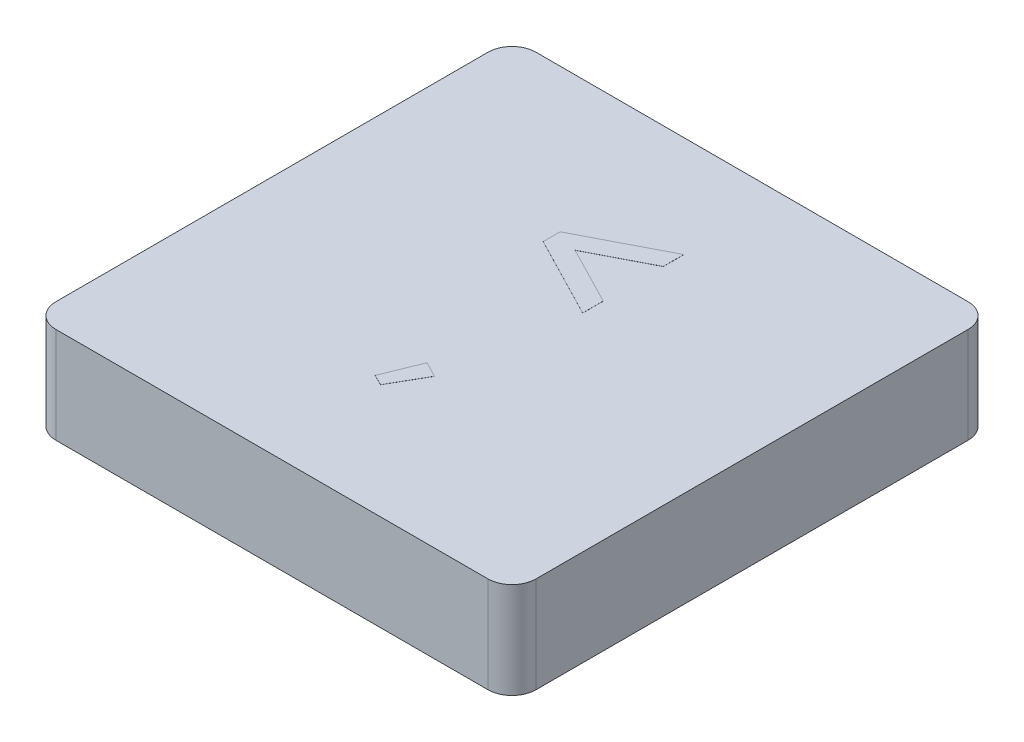
ISO-10303-21;
HEADER;
FILE_DESCRIPTION(('STEP AP214'),'2;1');
FILE_NAME('part.step','',(''),(''),'','','');
FILE_SCHEMA(('AUTOMOTIVE_DESIGN { 1 0 10303 214 1 1 1 1 }'));
ENDSEC;
DATA;
#1=APPLICATION_CONTEXT('core data for automotive mechanical design processes');
#2=APPLICATION_PROTOCOL_DEFINITION('international standard','automotive_design',2000,#1);
#3=PRODUCT_CONTEXT('',#1,'mechanical');
#4=PRODUCT('Part','Part','',(#3));
#5=PRODUCT_RELATED_PRODUCT_CATEGORY('part','',(#4));
#6=PRODUCT_DEFINITION_FORMATION('','',#4);
#7=PRODUCT_DEFINITION_CONTEXT('part definition',#1,'design');
#8=PRODUCT_DEFINITION('design','',#6,#7);
#9=PRODUCT_DEFINITION_SHAPE('','',#8);
#10=(LENGTH_UNIT() NAMED_UNIT(*) SI_UNIT(.MILLI.,.METRE.));
#11=(NAMED_UNIT(*) PLANE_ANGLE_UNIT() SI_UNIT($,.RADIAN.));
#12=(NAMED_UNIT(*) SI_UNIT($,.STERADIAN.) SOLID_ANGLE_UNIT());
#13=UNCERTAINTY_MEASURE_WITH_UNIT(LENGTH_MEASURE(1.E-05),#10,'distance_accuracy_value','');
#14=(GEOMETRIC_REPRESENTATION_CONTEXT(3) GLOBAL_UNCERTAINTY_ASSIGNED_CONTEXT((#13)) GLOBAL_UNIT_ASSIGNED_CONTEXT((#10,
#11,#12)) REPRESENTATION_CONTEXT('',''));
#15=CARTESIAN_POINT('',(0.,0.,0.));
#16=DIRECTION('',(0.,0.,1.));
#17=DIRECTION('',(1.,0.,0.));
#18=AXIS2_PLACEMENT_3D('',#15,#16,#17);
#19=CARTESIAN_POINT('',(0.,2.54,-12.7));
#20=DIRECTION('',(1.,0.,0.));
#21=DIRECTION('',(0.,0.,-1.));
#22=AXIS2_PLACEMENT_3D('',#19,#20,#21);
#23=PLANE('',#22);
#24=DIRECTION('',(0.,0.,1.));
#25=VECTOR('',#24,1.);
#26=CARTESIAN_POINT('',(0.,2.54,-12.7));
#27=LINE('',#26,#25);
#28=CARTESIAN_POINT('',(0.,2.54,-12.065));
#29=VERTEX_POINT('',#28);
#30=CARTESIAN_POINT('',(0.,2.54,-0.635));
#31=VERTEX_POINT('',#30);
#32=EDGE_CURVE('E321',#29,#31,#27,.T.);
#33=ORIENTED_EDGE('',*,*,#32,.F.);
#34=DIRECTION('',(0.,-1.,0.));
#35=VECTOR('',#34,1.);
#36=CARTESIAN_POINT('',(0.,2.54,-12.065));
#37=LINE('',#36,#35);
#38=CARTESIAN_POINT('',(0.,0.,-12.065));
#39=VERTEX_POINT('',#38);
#40=EDGE_CURVE('E346',#29,#39,#37,.T.);
#41=ORIENTED_EDGE('',*,*,#40,.T.);
#42=DIRECTION('',(0.,0.,1.));
#43=VECTOR('',#42,1.);
#44=CARTESIAN_POINT('',(0.,0.,-12.7));
#45=LINE('',#44,#43);
#46=CARTESIAN_POINT('',(0.,0.,-0.635));
#47=VERTEX_POINT('',#46);
#48=EDGE_CURVE('E301',#39,#47,#45,.T.);
#49=ORIENTED_EDGE('',*,*,#48,.T.);
#50=DIRECTION('',(0.,-1.,0.));
#51=VECTOR('',#50,1.);
#52=CARTESIAN_POINT('',(0.,2.54,-0.635));
#53=LINE('',#52,#51);
#54=EDGE_CURVE('E334',#47,#31,#53,.F.);
#55=ORIENTED_EDGE('',*,*,#54,.T.);
#56=EDGE_LOOP('',(#33,#41,#49,#55));
#57=FACE_BOUND('',#56,.T.);
#58=ADVANCED_FACE('F33',(#57),#23,.F.);
#59=CARTESIAN_POINT('',(0.,2.54,0.));
#60=DIRECTION('',(0.,0.,-1.));
#61=DIRECTION('',(-1.,0.,0.));
#62=AXIS2_PLACEMENT_3D('',#59,#60,#61);
#63=PLANE('',#62);
#64=DIRECTION('',(1.,0.,0.));
#65=VECTOR('',#64,1.);
#66=CARTESIAN_POINT('',(0.,0.,0.));
#67=LINE('',#66,#65);
#68=CARTESIAN_POINT('',(0.635,0.,0.));
#69=VERTEX_POINT('',#68);
#70=CARTESIAN_POINT('',(12.065,0.,0.));
#71=VERTEX_POINT('',#70);
#72=EDGE_CURVE('E337',#69,#71,#67,.T.);
#73=ORIENTED_EDGE('',*,*,#72,.T.);
#74=DIRECTION('',(0.,-1.,0.));
#75=VECTOR('',#74,1.);
#76=CARTESIAN_POINT('',(12.065,2.54,0.));
#77=LINE('',#76,#75);
#78=CARTESIAN_POINT('',(12.065,2.54,0.));
#79=VERTEX_POINT('',#78);
#80=EDGE_CURVE('E41',#71,#79,#77,.F.);
#81=ORIENTED_EDGE('',*,*,#80,.T.);
#82=DIRECTION('',(1.,0.,0.));
#83=VECTOR('',#82,1.);
#84=CARTESIAN_POINT('',(0.,2.54,0.));
#85=LINE('',#84,#83);
#86=CARTESIAN_POINT('',(0.635,2.54,0.));
#87=VERTEX_POINT('',#86);
#88=EDGE_CURVE('E324',#87,#79,#85,.T.);
#89=ORIENTED_EDGE('',*,*,#88,.F.);
#90=DIRECTION('',(0.,-1.,0.));
#91=VECTOR('',#90,1.);
#92=CARTESIAN_POINT('',(0.635,2.54,0.));
#93=LINE('',#92,#91);
#94=EDGE_CURVE('E375',#87,#69,#93,.T.);
#95=ORIENTED_EDGE('',*,*,#94,.T.);
#96=EDGE_LOOP('',(#73,#81,#89,#95));
#97=FACE_BOUND('',#96,.T.);
#98=ADVANCED_FACE('F380',(#97),#63,.F.);
#99=CARTESIAN_POINT('',(12.7,2.54,0.));
#100=DIRECTION('',(-1.,0.,0.));
#101=DIRECTION('',(0.,0.,1.));
#102=AXIS2_PLACEMENT_3D('',#99,#100,#101);
#103=PLANE('',#102);
#104=DIRECTION('',(0.,0.,-1.));
#105=VECTOR('',#104,1.);
#106=CARTESIAN_POINT('',(12.7,0.,0.));
#107=LINE('',#106,#105);
#108=CARTESIAN_POINT('',(12.7,0.,-0.635));
#109=VERTEX_POINT('',#108);
#110=CARTESIAN_POINT('',(12.7,0.,-12.065));
#111=VERTEX_POINT('',#110);
#112=EDGE_CURVE('E340',#109,#111,#107,.T.);
#113=ORIENTED_EDGE('',*,*,#112,.T.);
#114=DIRECTION('',(0.,-1.,0.));
#115=VECTOR('',#114,1.);
#116=CARTESIAN_POINT('',(12.7,2.54,-12.065));
#117=LINE('',#116,#115);
#118=CARTESIAN_POINT('',(12.7,2.54,-12.065));
#119=VERTEX_POINT('',#118);
#120=EDGE_CURVE('E373',#111,#119,#117,.F.);
#121=ORIENTED_EDGE('',*,*,#120,.T.);
#122=DIRECTION('',(0.,0.,-1.));
#123=VECTOR('',#122,1.);
#124=CARTESIAN_POINT('',(12.7,2.54,0.));
#125=LINE('',#124,#123);
#126=CARTESIAN_POINT('',(12.7,2.54,-0.635));
#127=VERTEX_POINT('',#126);
#128=EDGE_CURVE('E328',#127,#119,#125,.T.);
#129=ORIENTED_EDGE('',*,*,#128,.F.);
#130=DIRECTION('',(0.,-1.,0.));
#131=VECTOR('',#130,1.);
#132=CARTESIAN_POINT('',(12.7,2.54,-0.635));
#133=LINE('',#132,#131);
#134=EDGE_CURVE('E370',#127,#109,#133,.T.);
#135=ORIENTED_EDGE('',*,*,#134,.T.);
#136=EDGE_LOOP('',(#113,#121,#129,#135));
#137=FACE_BOUND('',#136,.T.);
#138=ADVANCED_FACE('F393',(#137),#103,.F.);
#139=CARTESIAN_POINT('',(12.7,2.54,-12.7));
#140=DIRECTION('',(0.,0.,1.));
#141=DIRECTION('',(1.,0.,0.));
#142=AXIS2_PLACEMENT_3D('',#139,#140,#141);
#143=PLANE('',#142);
#144=DIRECTION('',(-1.,0.,0.));
#145=VECTOR('',#144,1.);
#146=CARTESIAN_POINT('',(12.7,0.,-12.7));
#147=LINE('',#146,#145);
#148=CARTESIAN_POINT('',(12.065,0.,-12.7));
#149=VERTEX_POINT('',#148);
#150=CARTESIAN_POINT('',(0.634999999999995,0.,-12.7));
#151=VERTEX_POINT('',#150);
#152=EDGE_CURVE('E325',#149,#151,#147,.T.);
#153=ORIENTED_EDGE('',*,*,#152,.T.);
#154=DIRECTION('',(0.,-1.,0.));
#155=VECTOR('',#154,1.);
#156=CARTESIAN_POINT('',(0.634999999999995,2.54,-12.7));
#157=LINE('',#156,#155);
#158=CARTESIAN_POINT('',(0.634999999999995,2.54,-12.7));
#159=VERTEX_POINT('',#158);
#160=EDGE_CURVE('E360',#151,#159,#157,.F.);
#161=ORIENTED_EDGE('',*,*,#160,.T.);
#162=DIRECTION('',(-1.,0.,0.));
#163=VECTOR('',#162,1.);
#164=CARTESIAN_POINT('',(12.7,2.54,-12.7));
#165=LINE('',#164,#163);
#166=CARTESIAN_POINT('',(12.065,2.54,-12.7));
#167=VERTEX_POINT('',#166);
#168=EDGE_CURVE('E331',#167,#159,#165,.T.);
#169=ORIENTED_EDGE('',*,*,#168,.F.);
#170=DIRECTION('',(0.,-1.,0.));
#171=VECTOR('',#170,1.);
#172=CARTESIAN_POINT('',(12.065,2.54,-12.7));
#173=LINE('',#172,#171);
#174=EDGE_CURVE('E357',#167,#149,#173,.T.);
#175=ORIENTED_EDGE('',*,*,#174,.T.);
#176=EDGE_LOOP('',(#153,#161,#169,#175));
#177=FACE_BOUND('',#176,.T.);
#178=ADVANCED_FACE('F405',(#177),#143,.F.);
#179=CARTESIAN_POINT('',(0.,2.54,0.));
#180=DIRECTION('',(0.,1.,0.));
#181=DIRECTION('',(0.,0.,1.));
#182=AXIS2_PLACEMENT_3D('',#179,#180,#181);
#183=PLANE('',#182);
#184=DIRECTION('',(0.377411788957032,0.,-0.926045539677317));
#185=VECTOR('',#184,1.);
#186=CARTESIAN_POINT('',(5.91212475961538,2.54,-3.16612119391026));
#187=LINE('',#186,#185);
#188=CARTESIAN_POINT('',(5.91212475961538,2.54,-3.16612119391026));
#189=VERTEX_POINT('',#188);
#190=CARTESIAN_POINT('',(6.31027179487179,2.54,-4.14304427083333));
#191=VERTEX_POINT('',#190);
#192=EDGE_CURVE('E217',#189,#191,#187,.T.);
#193=ORIENTED_EDGE('',*,*,#192,.T.);
#194=DIRECTION('',(0.888237171489224,0.,0.459385162129583));
#195=VECTOR('',#194,1.);
#196=CARTESIAN_POINT('',(6.31027179487179,2.54,-4.14304427083333));
#197=LINE('',#196,#195);
#198=CARTESIAN_POINT('',(6.71732307692307,2.54,-3.93252243589744));
#199=VERTEX_POINT('',#198);
#200=EDGE_CURVE('E193',#191,#199,#197,.T.);
#201=ORIENTED_EDGE('',*,*,#200,.T.);
#202=DIRECTION('',(-0.497188445665933,0.,0.867642581652315));
#203=VECTOR('',#202,1.);
#204=CARTESIAN_POINT('',(6.71732307692307,2.54,-3.93252243589744));
#205=LINE('',#204,#203);
#206=CARTESIAN_POINT('',(6.19833269230769,2.54,-3.02683333333333));
#207=VERTEX_POINT('',#206);
#208=EDGE_CURVE('E53',#199,#207,#205,.T.);
#209=ORIENTED_EDGE('',*,*,#208,.T.);
#210=DIRECTION('',(-0.899171345852742,0.,-0.437596721648333));
#211=VECTOR('',#210,1.);
#212=CARTESIAN_POINT('',(6.19833269230769,2.54,-3.02683333333333));
#213=LINE('',#212,#211);
#214=EDGE_CURVE('E48',#207,#189,#213,.T.);
#215=ORIENTED_EDGE('',*,*,#214,.T.);
#216=EDGE_LOOP('',(#193,#201,#209,#215));
#217=FACE_BOUND('',#216,.T.);
#218=DIRECTION('',(0.888620657054864,0.,0.458642919770252));
#219=VECTOR('',#218,1.);
#220=CARTESIAN_POINT('',(5.68971193910256,2.54,-8.67914743589743));
#221=LINE('',#220,#219);
#222=CARTESIAN_POINT('',(5.68971193910256,2.54,-8.67914743589743));
#223=VERTEX_POINT('',#222);
#224=CARTESIAN_POINT('',(7.22760256410256,2.54,-7.88539743589743));
#225=VERTEX_POINT('',#224);
#226=EDGE_CURVE('E222',#223,#225,#221,.T.);
#227=ORIENTED_EDGE('',*,*,#226,.T.);
#228=DIRECTION('',(0.,0.,1.));
#229=VECTOR('',#228,1.);
#230=CARTESIAN_POINT('',(7.22760256410256,2.54,-7.88539743589743));
#231=LINE('',#230,#229);
#232=CARTESIAN_POINT('',(7.22760256410256,2.54,-7.34160236378205));
#233=VERTEX_POINT('',#232);
#234=EDGE_CURVE('E250',#225,#233,#231,.T.);
#235=ORIENTED_EDGE('',*,*,#234,.T.);
#236=DIRECTION('',(-0.888589658192358,0.,-0.458702975086916));
#237=VECTOR('',#236,1.);
#238=CARTESIAN_POINT('',(7.22760256410256,2.54,-7.34160236378205));
#239=LINE('',#238,#237);
#240=CARTESIAN_POINT('',(5.07023076923076,2.54,-8.45526923076923));
#241=VERTEX_POINT('',#240);
#242=EDGE_CURVE('E252',#233,#241,#239,.T.);
#243=ORIENTED_EDGE('',*,*,#242,.T.);
#244=DIRECTION('',(0.,0.,-1.));
#245=VECTOR('',#244,1.);
#246=CARTESIAN_POINT('',(5.07023076923076,2.54,-8.45526923076923));
#247=LINE('',#246,#245);
#248=CARTESIAN_POINT('',(5.07023076923076,2.54,-8.90366165865385));
#249=VERTEX_POINT('',#248);
#250=EDGE_CURVE('E254',#241,#249,#247,.T.);
#251=ORIENTED_EDGE('',*,*,#250,.T.);
#252=DIRECTION('',(0.888589658192358,0.,-0.458702975086916));
#253=VECTOR('',#252,1.);
#254=CARTESIAN_POINT('',(5.07023076923076,2.54,-8.90366165865385));
#255=LINE('',#254,#253);
#256=CARTESIAN_POINT('',(7.22760256410256,2.54,-10.017328525641));
#257=VERTEX_POINT('',#256);
#258=EDGE_CURVE('E256',#249,#257,#255,.T.);
#259=ORIENTED_EDGE('',*,*,#258,.T.);
#260=DIRECTION('',(0.,0.,1.));
#261=VECTOR('',#260,1.);
#262=CARTESIAN_POINT('',(7.22760256410256,2.54,-10.017328525641));
#263=LINE('',#262,#261);
#264=CARTESIAN_POINT('',(7.22760256410256,2.54,-9.47289743589744));
#265=VERTEX_POINT('',#264);
#266=EDGE_CURVE('E258',#257,#265,#263,.T.);
#267=ORIENTED_EDGE('',*,*,#266,.T.);
#268=DIRECTION('',(-0.888620657054864,0.,0.458642919770253));
#269=VECTOR('',#268,1.);
#270=CARTESIAN_POINT('',(7.22760256410256,2.54,-9.47289743589744));
#271=LINE('',#270,#269);
#272=EDGE_CURVE('E230',#265,#223,#271,.T.);
#273=ORIENTED_EDGE('',*,*,#272,.T.);
#274=EDGE_LOOP('',(#227,#235,#243,#251,#259,#267,#273));
#275=FACE_BOUND('',#274,.T.);
#276=ORIENTED_EDGE('',*,*,#168,.T.);
#277=CARTESIAN_POINT('',(0.634999999999995,2.54,-12.065));
#278=DIRECTION('',(0.,1.,0.));
#279=DIRECTION('',(0.,0.,1.));
#280=AXIS2_PLACEMENT_3D('',#277,#278,#279);
#281=CIRCLE('',#280,0.635);
#282=EDGE_CURVE('E368',#159,#29,#281,.T.);
#283=ORIENTED_EDGE('',*,*,#282,.T.);
#284=ORIENTED_EDGE('',*,*,#32,.T.);
#285=CARTESIAN_POINT('',(0.635,2.54,-0.635));
#286=DIRECTION('',(0.,1.,0.));
#287=DIRECTION('',(0.,0.,1.));
#288=AXIS2_PLACEMENT_3D('',#285,#286,#287);
#289=CIRCLE('',#288,0.635);
#290=EDGE_CURVE('E362',#31,#87,#289,.T.);
#291=ORIENTED_EDGE('',*,*,#290,.T.);
#292=ORIENTED_EDGE('',*,*,#88,.T.);
#293=CARTESIAN_POINT('',(12.065,2.54,-0.635));
#294=DIRECTION('',(0.,1.,0.));
#295=DIRECTION('',(0.,0.,1.));
#296=AXIS2_PLACEMENT_3D('',#293,#294,#295);
#297=CIRCLE('',#296,0.635);
#298=EDGE_CURVE('E364',#79,#127,#297,.T.);
#299=ORIENTED_EDGE('',*,*,#298,.T.);
#300=ORIENTED_EDGE('',*,*,#128,.T.);
#301=CARTESIAN_POINT('',(12.065,2.54,-12.065));
#302=DIRECTION('',(0.,1.,0.));
#303=DIRECTION('',(0.,0.,1.));
#304=AXIS2_PLACEMENT_3D('',#301,#302,#303);
#305=CIRCLE('',#304,0.635);
#306=EDGE_CURVE('E366',#119,#167,#305,.T.);
#307=ORIENTED_EDGE('',*,*,#306,.T.);
#308=EDGE_LOOP('',(#276,#283,#284,#291,#292,#299,#300,#307));
#309=FACE_BOUND('',#308,.T.);
#310=ADVANCED_FACE('F386',(#217,#275,#309),#183,.T.);
#311=CARTESIAN_POINT('',(0.,0.,0.));
#312=DIRECTION('',(0.,1.,0.));
#313=DIRECTION('',(0.,0.,1.));
#314=AXIS2_PLACEMENT_3D('',#311,#312,#313);
#315=PLANE('',#314);
#316=DIRECTION('',(-1.,0.,0.));
#317=VECTOR('',#316,1.);
#318=CARTESIAN_POINT('',(12.7,0.,-12.065));
#319=LINE('',#318,#317);
#320=CARTESIAN_POINT('',(12.065,0.,-12.065));
#321=VERTEX_POINT('',#320);
#322=CARTESIAN_POINT('',(0.634999999999995,0.,-12.065));
#323=VERTEX_POINT('',#322);
#324=EDGE_CURVE('E289',#321,#323,#319,.T.);
#325=ORIENTED_EDGE('',*,*,#324,.T.);
#326=DIRECTION('',(0.,0.,1.));
#327=VECTOR('',#326,1.);
#328=CARTESIAN_POINT('',(0.634999999999995,0.,-12.7));
#329=LINE('',#328,#327);
#330=CARTESIAN_POINT('',(0.635,0.,-0.635));
#331=VERTEX_POINT('',#330);
#332=EDGE_CURVE('E284',#323,#331,#329,.T.);
#333=ORIENTED_EDGE('',*,*,#332,.T.);
#334=DIRECTION('',(1.,0.,0.));
#335=VECTOR('',#334,1.);
#336=CARTESIAN_POINT('',(0.,0.,-0.635));
#337=LINE('',#336,#335);
#338=CARTESIAN_POINT('',(12.065,0.,-0.635));
#339=VERTEX_POINT('',#338);
#340=EDGE_CURVE('E313',#331,#339,#337,.T.);
#341=ORIENTED_EDGE('',*,*,#340,.T.);
#342=DIRECTION('',(0.,0.,-1.));
#343=VECTOR('',#342,1.);
#344=CARTESIAN_POINT('',(12.065,0.,0.));
#345=LINE('',#344,#343);
#346=EDGE_CURVE('E316',#339,#321,#345,.T.);
#347=ORIENTED_EDGE('',*,*,#346,.T.);
#348=EDGE_LOOP('',(#325,#333,#341,#347));
#349=FACE_BOUND('',#348,.T.);
#350=ORIENTED_EDGE('',*,*,#48,.F.);
#351=CARTESIAN_POINT('',(0.634999999999995,0.,-12.065));
#352=DIRECTION('',(0.,1.,0.));
#353=DIRECTION('',(0.,0.,1.));
#354=AXIS2_PLACEMENT_3D('',#351,#352,#353);
#355=CIRCLE('',#354,0.635);
#356=EDGE_CURVE('E355',#39,#151,#355,.F.);
#357=ORIENTED_EDGE('',*,*,#356,.T.);
#358=ORIENTED_EDGE('',*,*,#152,.F.);
#359=CARTESIAN_POINT('',(12.065,0.,-12.065));
#360=DIRECTION('',(0.,1.,0.));
#361=DIRECTION('',(0.,0.,1.));
#362=AXIS2_PLACEMENT_3D('',#359,#360,#361);
#363=CIRCLE('',#362,0.635);
#364=EDGE_CURVE('E353',#149,#111,#363,.F.);
#365=ORIENTED_EDGE('',*,*,#364,.T.);
#366=ORIENTED_EDGE('',*,*,#112,.F.);
#367=CARTESIAN_POINT('',(12.065,0.,-0.635));
#368=DIRECTION('',(0.,1.,0.));
#369=DIRECTION('',(0.,0.,1.));
#370=AXIS2_PLACEMENT_3D('',#367,#368,#369);
#371=CIRCLE('',#370,0.635);
#372=EDGE_CURVE('E351',#109,#71,#371,.F.);
#373=ORIENTED_EDGE('',*,*,#372,.T.);
#374=ORIENTED_EDGE('',*,*,#72,.F.);
#375=CARTESIAN_POINT('',(0.635,0.,-0.635));
#376=DIRECTION('',(0.,1.,0.));
#377=DIRECTION('',(0.,0.,1.));
#378=AXIS2_PLACEMENT_3D('',#375,#376,#377);
#379=CIRCLE('',#378,0.635);
#380=EDGE_CURVE('E349',#69,#47,#379,.F.);
#381=ORIENTED_EDGE('',*,*,#380,.T.);
#382=EDGE_LOOP('',(#350,#357,#358,#365,#366,#373,#374,#381));
#383=FACE_BOUND('',#382,.T.);
#384=ADVANCED_FACE('F397',(#349,#383),#315,.F.);
#385=CARTESIAN_POINT('',(0.634999999999995,2.54,-12.065));
#386=DIRECTION('',(0.,-1.,0.));
#387=DIRECTION('',(0.,0.,-1.));
#388=AXIS2_PLACEMENT_3D('',#385,#386,#387);
#389=CYLINDRICAL_SURFACE('',#388,0.635);
#390=ORIENTED_EDGE('',*,*,#282,.F.);
#391=ORIENTED_EDGE('',*,*,#160,.F.);
#392=ORIENTED_EDGE('',*,*,#356,.F.);
#393=ORIENTED_EDGE('',*,*,#40,.F.);
#394=EDGE_LOOP('',(#390,#391,#392,#393));
#395=FACE_BOUND('',#394,.T.);
#396=ADVANCED_FACE('F411',(#395),#389,.T.);
#397=CARTESIAN_POINT('',(12.065,2.54,-12.065));
#398=DIRECTION('',(0.,-1.,0.));
#399=DIRECTION('',(0.,0.,-1.));
#400=AXIS2_PLACEMENT_3D('',#397,#398,#399);
#401=CYLINDRICAL_SURFACE('',#400,0.635);
#402=ORIENTED_EDGE('',*,*,#306,.F.);
#403=ORIENTED_EDGE('',*,*,#120,.F.);
#404=ORIENTED_EDGE('',*,*,#364,.F.);
#405=ORIENTED_EDGE('',*,*,#174,.F.);
#406=EDGE_LOOP('',(#402,#403,#404,#405));
#407=FACE_BOUND('',#406,.T.);
#408=ADVANCED_FACE('F402',(#407),#401,.T.);
#409=CARTESIAN_POINT('',(12.065,2.54,-0.635));
#410=DIRECTION('',(0.,-1.,0.));
#411=DIRECTION('',(0.,0.,-1.));
#412=AXIS2_PLACEMENT_3D('',#409,#410,#411);
#413=CYLINDRICAL_SURFACE('',#412,0.635);
#414=ORIENTED_EDGE('',*,*,#298,.F.);
#415=ORIENTED_EDGE('',*,*,#80,.F.);
#416=ORIENTED_EDGE('',*,*,#372,.F.);
#417=ORIENTED_EDGE('',*,*,#134,.F.);
#418=EDGE_LOOP('',(#414,#415,#416,#417));
#419=FACE_BOUND('',#418,.T.);
#420=ADVANCED_FACE('F390',(#419),#413,.T.);
#421=CARTESIAN_POINT('',(0.635,2.54,-0.635));
#422=DIRECTION('',(0.,-1.,0.));
#423=DIRECTION('',(0.,0.,-1.));
#424=AXIS2_PLACEMENT_3D('',#421,#422,#423);
#425=CYLINDRICAL_SURFACE('',#424,0.635);
#426=ORIENTED_EDGE('',*,*,#290,.F.);
#427=ORIENTED_EDGE('',*,*,#54,.F.);
#428=ORIENTED_EDGE('',*,*,#380,.F.);
#429=ORIENTED_EDGE('',*,*,#94,.F.);
#430=EDGE_LOOP('',(#426,#427,#428,#429));
#431=FACE_BOUND('',#430,.T.);
#432=ADVANCED_FACE('F35',(#431),#425,.T.);
#433=CARTESIAN_POINT('',(0.634999999999995,2.54,-12.7));
#434=DIRECTION('',(1.,0.,0.));
#435=DIRECTION('',(0.,0.,-1.));
#436=AXIS2_PLACEMENT_3D('',#433,#434,#435);
#437=PLANE('',#436);
#438=DIRECTION('',(0.,0.,1.));
#439=VECTOR('',#438,1.);
#440=CARTESIAN_POINT('',(0.634999999999995,1.905,-12.7));
#441=LINE('',#440,#439);
#442=CARTESIAN_POINT('',(0.634999999999995,1.905,-12.065));
#443=VERTEX_POINT('',#442);
#444=CARTESIAN_POINT('',(0.635,1.905,-0.635));
#445=VERTEX_POINT('',#444);
#446=EDGE_CURVE('E285',#443,#445,#441,.T.);
#447=ORIENTED_EDGE('',*,*,#446,.T.);
#448=DIRECTION('',(0.,1.,0.));
#449=VECTOR('',#448,1.);
#450=CARTESIAN_POINT('',(0.635,2.54,-0.635));
#451=LINE('',#450,#449);
#452=EDGE_CURVE('E294',#331,#445,#451,.T.);
#453=ORIENTED_EDGE('',*,*,#452,.F.);
#454=ORIENTED_EDGE('',*,*,#332,.F.);
#455=DIRECTION('',(0.,1.,0.));
#456=VECTOR('',#455,1.);
#457=CARTESIAN_POINT('',(0.634999999999995,2.54,-12.065));
#458=LINE('',#457,#456);
#459=EDGE_CURVE('E290',#323,#443,#458,.T.);
#460=ORIENTED_EDGE('',*,*,#459,.T.);
#461=EDGE_LOOP('',(#447,#453,#454,#460));
#462=FACE_BOUND('',#461,.T.);
#463=ADVANCED_FACE('F416',(#462),#437,.T.);
#464=CARTESIAN_POINT('',(0.,2.54,-0.635));
#465=DIRECTION('',(0.,0.,-1.));
#466=DIRECTION('',(-1.,0.,0.));
#467=AXIS2_PLACEMENT_3D('',#464,#465,#466);
#468=PLANE('',#467);
#469=ORIENTED_EDGE('',*,*,#340,.F.);
#470=ORIENTED_EDGE('',*,*,#452,.T.);
#471=DIRECTION('',(1.,0.,0.));
#472=VECTOR('',#471,1.);
#473=CARTESIAN_POINT('',(0.,1.905,-0.635));
#474=LINE('',#473,#472);
#475=CARTESIAN_POINT('',(12.065,1.905,-0.635));
#476=VERTEX_POINT('',#475);
#477=EDGE_CURVE('E288',#445,#476,#474,.T.);
#478=ORIENTED_EDGE('',*,*,#477,.T.);
#479=DIRECTION('',(0.,1.,0.));
#480=VECTOR('',#479,1.);
#481=CARTESIAN_POINT('',(12.065,2.54,-0.635));
#482=LINE('',#481,#480);
#483=EDGE_CURVE('E298',#339,#476,#482,.T.);
#484=ORIENTED_EDGE('',*,*,#483,.F.);
#485=EDGE_LOOP('',(#469,#470,#478,#484));
#486=FACE_BOUND('',#485,.T.);
#487=ADVANCED_FACE('F421',(#486),#468,.T.);
#488=CARTESIAN_POINT('',(12.065,2.54,0.));
#489=DIRECTION('',(-1.,0.,0.));
#490=DIRECTION('',(0.,0.,1.));
#491=AXIS2_PLACEMENT_3D('',#488,#489,#490);
#492=PLANE('',#491);
#493=ORIENTED_EDGE('',*,*,#346,.F.);
#494=ORIENTED_EDGE('',*,*,#483,.T.);
#495=DIRECTION('',(0.,0.,-1.));
#496=VECTOR('',#495,1.);
#497=CARTESIAN_POINT('',(12.065,1.905,0.));
#498=LINE('',#497,#496);
#499=CARTESIAN_POINT('',(12.065,1.905,-12.065));
#500=VERTEX_POINT('',#499);
#501=EDGE_CURVE('E304',#476,#500,#498,.T.);
#502=ORIENTED_EDGE('',*,*,#501,.T.);
#503=DIRECTION('',(0.,1.,0.));
#504=VECTOR('',#503,1.);
#505=CARTESIAN_POINT('',(12.065,2.54,-12.065));
#506=LINE('',#505,#504);
#507=EDGE_CURVE('E293',#321,#500,#506,.T.);
#508=ORIENTED_EDGE('',*,*,#507,.F.);
#509=EDGE_LOOP('',(#493,#494,#502,#508));
#510=FACE_BOUND('',#509,.T.);
#511=ADVANCED_FACE('F474',(#510),#492,.T.);
#512=CARTESIAN_POINT('',(12.7,2.54,-12.065));
#513=DIRECTION('',(0.,0.,1.));
#514=DIRECTION('',(1.,0.,0.));
#515=AXIS2_PLACEMENT_3D('',#512,#513,#514);
#516=PLANE('',#515);
#517=ORIENTED_EDGE('',*,*,#324,.F.);
#518=ORIENTED_EDGE('',*,*,#507,.T.);
#519=DIRECTION('',(-1.,0.,0.));
#520=VECTOR('',#519,1.);
#521=CARTESIAN_POINT('',(12.7,1.905,-12.065));
#522=LINE('',#521,#520);
#523=EDGE_CURVE('E297',#500,#443,#522,.T.);
#524=ORIENTED_EDGE('',*,*,#523,.T.);
#525=ORIENTED_EDGE('',*,*,#459,.F.);
#526=EDGE_LOOP('',(#517,#518,#524,#525));
#527=FACE_BOUND('',#526,.T.);
#528=ADVANCED_FACE('F484',(#527),#516,.T.);
#529=CARTESIAN_POINT('',(0.,1.905,0.));
#530=DIRECTION('',(0.,1.,0.));
#531=DIRECTION('',(0.,0.,1.));
#532=AXIS2_PLACEMENT_3D('',#529,#530,#531);
#533=PLANE('',#532);
#534=CARTESIAN_POINT('',(6.34999999999999,1.905,-6.35));
#535=DIRECTION('',(0.,1.,0.));
#536=DIRECTION('',(0.,0.,1.));
#537=AXIS2_PLACEMENT_3D('',#534,#535,#536);
#538=CIRCLE('',#537,2.54);
#539=CARTESIAN_POINT('',(6.34999999999999,1.905,-3.81));
#540=VERTEX_POINT('',#539);
#541=EDGE_CURVE('E11',#540,#540,#538,.F.);
#542=ORIENTED_EDGE('',*,*,#541,.F.);
#543=EDGE_LOOP('',(#542));
#544=FACE_BOUND('',#543,.T.);
#545=ORIENTED_EDGE('',*,*,#523,.F.);
#546=ORIENTED_EDGE('',*,*,#501,.F.);
#547=ORIENTED_EDGE('',*,*,#477,.F.);
#548=ORIENTED_EDGE('',*,*,#446,.F.);
#549=EDGE_LOOP('',(#545,#546,#547,#548));
#550=FACE_BOUND('',#549,.T.);
#551=ADVANCED_FACE('F494',(#544,#550),#533,.F.);
#552=CARTESIAN_POINT('',(6.34999999999999,-7.18420489685532,-6.35));
#553=DIRECTION('',(0.,1.,0.));
#554=DIRECTION('',(0.,0.,1.));
#555=AXIS2_PLACEMENT_3D('',#552,#553,#554);
#556=CYLINDRICAL_SURFACE('',#555,2.54);
#557=CARTESIAN_POINT('',(6.34999999999999,0.,-6.35));
#558=DIRECTION('',(0.,1.,0.));
#559=DIRECTION('',(0.,0.,1.));
#560=AXIS2_PLACEMENT_3D('',#557,#558,#559);
#561=CIRCLE('',#560,2.54);
#562=CARTESIAN_POINT('',(6.34999999999999,0.,-3.81));
#563=VERTEX_POINT('',#562);
#564=EDGE_CURVE('E264',#563,#563,#561,.T.);
#565=CARTESIAN_POINT('',(6.34999999999999,0.,-3.81));
#566=CARTESIAN_POINT('',(6.34999999999999,0.0198437499999991,-3.81));
#567=CARTESIAN_POINT('',(6.34999999999999,0.0396874999999989,-3.81));
#568=CARTESIAN_POINT('',(6.34999999999999,0.079374999999999,-3.81));
#569=CARTESIAN_POINT('',(6.34999999999999,0.0992187499999992,-3.81));
#570=CARTESIAN_POINT('',(6.34999999999999,0.138906249999999,-3.81));
#571=CARTESIAN_POINT('',(6.34999999999999,0.158749999999999,-3.81));
#572=CARTESIAN_POINT('',(6.34999999999999,0.198437499999999,-3.81));
#573=CARTESIAN_POINT('',(6.34999999999999,0.218281249999999,-3.81));
#574=CARTESIAN_POINT('',(6.34999999999999,0.25796875,-3.81));
#575=CARTESIAN_POINT('',(6.34999999999999,0.277812499999999,-3.81));
#576=CARTESIAN_POINT('',(6.34999999999999,0.317499999999999,-3.81));
#577=CARTESIAN_POINT('',(6.34999999999999,0.337343749999999,-3.81));
#578=CARTESIAN_POINT('',(6.34999999999999,0.377031249999999,-3.81));
#579=CARTESIAN_POINT('',(6.34999999999999,0.396874999999999,-3.81));
#580=CARTESIAN_POINT('',(6.34999999999999,0.436562499999999,-3.81));
#581=CARTESIAN_POINT('',(6.34999999999999,0.456406249999999,-3.81));
#582=CARTESIAN_POINT('',(6.34999999999999,0.496093749999999,-3.81));
#583=CARTESIAN_POINT('',(6.34999999999999,0.515937499999999,-3.81));
#584=CARTESIAN_POINT('',(6.34999999999999,0.555624999999999,-3.81));
#585=CARTESIAN_POINT('',(6.34999999999999,0.575468749999999,-3.81));
#586=CARTESIAN_POINT('',(6.34999999999999,0.615156249999999,-3.81));
#587=CARTESIAN_POINT('',(6.34999999999999,0.634999999999999,-3.81));
#588=CARTESIAN_POINT('',(6.34999999999999,0.674687499999998,-3.81));
#589=CARTESIAN_POINT('',(6.34999999999999,0.694531249999998,-3.81));
#590=CARTESIAN_POINT('',(6.34999999999999,0.734218749999998,-3.81));
#591=CARTESIAN_POINT('',(6.34999999999999,0.754062499999998,-3.81));
#592=CARTESIAN_POINT('',(6.34999999999999,0.793749999999998,-3.81));
#593=CARTESIAN_POINT('',(6.34999999999999,0.813593749999999,-3.81));
#594=CARTESIAN_POINT('',(6.34999999999999,0.853281249999999,-3.81));
#595=CARTESIAN_POINT('',(6.34999999999999,0.873124999999999,-3.81));
#596=CARTESIAN_POINT('',(6.34999999999999,0.912812499999999,-3.81));
#597=CARTESIAN_POINT('',(6.34999999999999,0.932656249999999,-3.81));
#598=CARTESIAN_POINT('',(6.34999999999999,0.972343749999998,-3.81));
#599=CARTESIAN_POINT('',(6.34999999999999,0.992187499999998,-3.81));
#600=CARTESIAN_POINT('',(6.34999999999999,1.031875,-3.81));
#601=CARTESIAN_POINT('',(6.34999999999999,1.05171875,-3.81));
#602=CARTESIAN_POINT('',(6.34999999999999,1.09140625,-3.81));
#603=CARTESIAN_POINT('',(6.34999999999999,1.11125,-3.81));
#604=CARTESIAN_POINT('',(6.34999999999999,1.1509375,-3.81));
#605=CARTESIAN_POINT('',(6.34999999999999,1.17078125,-3.81));
#606=CARTESIAN_POINT('',(6.34999999999999,1.21046875,-3.81));
#607=CARTESIAN_POINT('',(6.34999999999999,1.2303125,-3.81));
#608=CARTESIAN_POINT('',(6.34999999999999,1.27,-3.81));
#609=CARTESIAN_POINT('',(6.34999999999999,1.28984375,-3.81));
#610=CARTESIAN_POINT('',(6.34999999999999,1.32953125,-3.81));
#611=CARTESIAN_POINT('',(6.34999999999999,1.349375,-3.81));
#612=CARTESIAN_POINT('',(6.34999999999999,1.3890625,-3.81));
#613=CARTESIAN_POINT('',(6.34999999999999,1.40890625,-3.81));
#614=CARTESIAN_POINT('',(6.34999999999999,1.44859375,-3.81));
#615=CARTESIAN_POINT('',(6.34999999999999,1.4684375,-3.81));
#616=CARTESIAN_POINT('',(6.34999999999999,1.508125,-3.81));
#617=CARTESIAN_POINT('',(6.34999999999999,1.52796875,-3.81));
#618=CARTESIAN_POINT('',(6.34999999999999,1.56765625,-3.81));
#619=CARTESIAN_POINT('',(6.34999999999999,1.5875,-3.81));
#620=CARTESIAN_POINT('',(6.34999999999999,1.6271875,-3.81));
#621=CARTESIAN_POINT('',(6.34999999999999,1.64703125,-3.81));
#622=CARTESIAN_POINT('',(6.34999999999999,1.68671875,-3.81));
#623=CARTESIAN_POINT('',(6.34999999999999,1.7065625,-3.81));
#624=CARTESIAN_POINT('',(6.34999999999999,1.74625,-3.81));
#625=CARTESIAN_POINT('',(6.34999999999999,1.76609375,-3.81));
#626=CARTESIAN_POINT('',(6.34999999999999,1.80578125,-3.81));
#627=CARTESIAN_POINT('',(6.34999999999999,1.825625,-3.81));
#628=CARTESIAN_POINT('',(6.34999999999999,1.8653125,-3.81));
#629=CARTESIAN_POINT('',(6.34999999999999,1.88515625,-3.81));
#630=CARTESIAN_POINT('',(6.34999999999999,1.905,-3.81));
#631=B_SPLINE_CURVE_WITH_KNOTS('',3,(#565,#566,#567,#568,#569,#570,#571,#572,#573,#574,#575,
#576,#577,#578,#579,#580,#581,#582,#583,#584,#585,#586,#587,#588,#589,#590,#591,#592,#593,#594,
#595,#596,#597,#598,#599,#600,#601,#602,#603,#604,#605,#606,#607,#608,#609,#610,#611,#612,#613,
#614,#615,#616,#617,#618,#619,#620,#621,#622,#623,#624,#625,#626,#627,#628,#629,#630),
.UNSPECIFIED.,.F.,.F.,(4,2,2,2,2,2,2,2,2,2,2,2,2,2,2,2,2,2,2,2,2,2,2,2,2,2,2,2,2,2,2,2,4),(0.,
0.0595312499999997,0.1190625,0.17859375,0.238125,0.29765625,0.3571875,0.41671875,0.47625,
0.53578125,0.5953125,0.654843749999999,0.714374999999999,0.773906249999999,0.8334375,0.89296875,
0.952499999999999,1.01203125,1.0715625,1.13109375,1.190625,1.25015625,1.3096875,1.36921875,
1.42875,1.48828125,1.5478125,1.60734375,1.666875,1.72640625,1.7859375,1.84546875,1.905),.UNSPECIFIED.);
#632=EDGE_CURVE('BSEAM504',#563,#540,#631,.T.);
#633=ORIENTED_EDGE('',*,*,#564,.T.);
#634=ORIENTED_EDGE('',*,*,#541,.T.);
#635=ORIENTED_EDGE('',*,*,#632,.T.);
#636=ORIENTED_EDGE('',*,*,#632,.F.);
#637=EDGE_LOOP('',(#633,#635,#634,#636));
#638=FACE_BOUND('',#637,.T.);
#639=ADVANCED_FACE('F504',(#638),#556,.T.);
#640=CARTESIAN_POINT('',(0.,0.,0.));
#641=DIRECTION('',(0.,1.,0.));
#642=DIRECTION('',(0.,0.,1.));
#643=AXIS2_PLACEMENT_3D('',#640,#641,#642);
#644=PLANE('',#643);
#645=ORIENTED_EDGE('',*,*,#564,.F.);
#646=EDGE_LOOP('',(#645));
#647=FACE_BOUND('',#646,.T.);
#648=ADVANCED_FACE('F514',(#647),#644,.F.);
#649=CARTESIAN_POINT('',(5.68971193910256,2.54254,-8.67914743589743));
#650=DIRECTION('',(0.458642919770252,0.,-0.888620657054864));
#651=DIRECTION('',(-0.888620657054864,0.,-0.458642919770252));
#652=AXIS2_PLACEMENT_3D('',#649,#650,#651);
#653=PLANE('',#652);
#654=ORIENTED_EDGE('',*,*,#226,.F.);
#655=DIRECTION('',(0.,-1.,0.));
#656=VECTOR('',#655,1.);
#657=CARTESIAN_POINT('',(5.68971193910256,2.54254,-8.67914743589743));
#658=LINE('',#657,#656);
#659=CARTESIAN_POINT('',(5.68971193910256,2.54254,-8.67914743589743));
#660=VERTEX_POINT('',#659);
#661=EDGE_CURVE('E261',#660,#223,#658,.T.);
#662=ORIENTED_EDGE('',*,*,#661,.F.);
#663=DIRECTION('',(0.888620657054864,0.,0.458642919770252));
#664=VECTOR('',#663,1.);
#665=CARTESIAN_POINT('',(5.68971193910256,2.54254,-8.67914743589743));
#666=LINE('',#665,#664);
#667=CARTESIAN_POINT('',(7.22760256410256,2.54254,-7.88539743589743));
#668=VERTEX_POINT('',#667);
#669=EDGE_CURVE('E226',#660,#668,#666,.T.);
#670=ORIENTED_EDGE('',*,*,#669,.T.);
#671=DIRECTION('',(0.,-1.,0.));
#672=VECTOR('',#671,1.);
#673=CARTESIAN_POINT('',(7.22760256410256,2.54254,-7.88539743589743));
#674=LINE('',#673,#672);
#675=EDGE_CURVE('E248',#668,#225,#674,.T.);
#676=ORIENTED_EDGE('',*,*,#675,.T.);
#677=EDGE_LOOP('',(#654,#662,#670,#676));
#678=FACE_BOUND('',#677,.T.);
#679=ADVANCED_FACE('F524',(#678),#653,.T.);
#680=CARTESIAN_POINT('',(7.22760256410256,2.54254,-9.47289743589744));
#681=DIRECTION('',(0.458642919770253,0.,0.888620657054864));
#682=DIRECTION('',(0.888620657054864,0.,-0.458642919770253));
#683=AXIS2_PLACEMENT_3D('',#680,#681,#682);
#684=PLANE('',#683);
#685=ORIENTED_EDGE('',*,*,#272,.F.);
#686=DIRECTION('',(0.,-1.,0.));
#687=VECTOR('',#686,1.);
#688=CARTESIAN_POINT('',(7.22760256410256,2.54254,-9.47289743589744));
#689=LINE('',#688,#687);
#690=CARTESIAN_POINT('',(7.22760256410256,2.54254,-9.47289743589744));
#691=VERTEX_POINT('',#690);
#692=EDGE_CURVE('E265',#691,#265,#689,.T.);
#693=ORIENTED_EDGE('',*,*,#692,.F.);
#694=DIRECTION('',(-0.888620657054864,0.,0.458642919770253));
#695=VECTOR('',#694,1.);
#696=CARTESIAN_POINT('',(7.22760256410256,2.54254,-9.47289743589744));
#697=LINE('',#696,#695);
#698=EDGE_CURVE('E245',#691,#660,#697,.T.);
#699=ORIENTED_EDGE('',*,*,#698,.T.);
#700=ORIENTED_EDGE('',*,*,#661,.T.);
#701=EDGE_LOOP('',(#685,#693,#699,#700));
#702=FACE_BOUND('',#701,.T.);
#703=ADVANCED_FACE('F542',(#702),#684,.T.);
#704=CARTESIAN_POINT('',(7.22760256410256,2.54254,-10.017328525641));
#705=DIRECTION('',(1.,0.,0.));
#706=DIRECTION('',(0.,0.,-1.));
#707=AXIS2_PLACEMENT_3D('',#704,#705,#706);
#708=PLANE('',#707);
#709=ORIENTED_EDGE('',*,*,#266,.F.);
#710=DIRECTION('',(0.,-1.,0.));
#711=VECTOR('',#710,1.);
#712=CARTESIAN_POINT('',(7.22760256410256,2.54254,-10.017328525641));
#713=LINE('',#712,#711);
#714=CARTESIAN_POINT('',(7.22760256410256,2.54254,-10.017328525641));
#715=VERTEX_POINT('',#714);
#716=EDGE_CURVE('E268',#715,#257,#713,.T.);
#717=ORIENTED_EDGE('',*,*,#716,.F.);
#718=DIRECTION('',(0.,0.,1.));
#719=VECTOR('',#718,1.);
#720=CARTESIAN_POINT('',(7.22760256410256,2.54254,-10.017328525641));
#721=LINE('',#720,#719);
#722=EDGE_CURVE('E242',#715,#691,#721,.T.);
#723=ORIENTED_EDGE('',*,*,#722,.T.);
#724=ORIENTED_EDGE('',*,*,#692,.T.);
#725=EDGE_LOOP('',(#709,#717,#723,#724));
#726=FACE_BOUND('',#725,.T.);
#727=ADVANCED_FACE('F552',(#726),#708,.T.);
#728=CARTESIAN_POINT('',(5.07023076923076,2.54254,-8.90366165865385));
#729=DIRECTION('',(-0.458702975086916,0.,-0.888589658192358));
#730=DIRECTION('',(-0.888589658192358,0.,0.458702975086916));
#731=AXIS2_PLACEMENT_3D('',#728,#729,#730);
#732=PLANE('',#731);
#733=ORIENTED_EDGE('',*,*,#258,.F.);
#734=DIRECTION('',(0.,-1.,0.));
#735=VECTOR('',#734,1.);
#736=CARTESIAN_POINT('',(5.07023076923076,2.54254,-8.90366165865385));
#737=LINE('',#736,#735);
#738=CARTESIAN_POINT('',(5.07023076923076,2.54254,-8.90366165865385));
#739=VERTEX_POINT('',#738);
#740=EDGE_CURVE('E271',#739,#249,#737,.T.);
#741=ORIENTED_EDGE('',*,*,#740,.F.);
#742=DIRECTION('',(0.888589658192358,0.,-0.458702975086916));
#743=VECTOR('',#742,1.);
#744=CARTESIAN_POINT('',(5.07023076923076,2.54254,-8.90366165865385));
#745=LINE('',#744,#743);
#746=EDGE_CURVE('E239',#739,#715,#745,.T.);
#747=ORIENTED_EDGE('',*,*,#746,.T.);
#748=ORIENTED_EDGE('',*,*,#716,.T.);
#749=EDGE_LOOP('',(#733,#741,#747,#748));
#750=FACE_BOUND('',#749,.T.);
#751=ADVANCED_FACE('F562',(#750),#732,.T.);
#752=CARTESIAN_POINT('',(5.07023076923076,2.54254,-8.45526923076923));
#753=DIRECTION('',(-1.,0.,0.));
#754=DIRECTION('',(0.,0.,1.));
#755=AXIS2_PLACEMENT_3D('',#752,#753,#754);
#756=PLANE('',#755);
#757=ORIENTED_EDGE('',*,*,#250,.F.);
#758=DIRECTION('',(0.,-1.,0.));
#759=VECTOR('',#758,1.);
#760=CARTESIAN_POINT('',(5.07023076923076,2.54254,-8.45526923076923));
#761=LINE('',#760,#759);
#762=CARTESIAN_POINT('',(5.07023076923076,2.54254,-8.45526923076923));
#763=VERTEX_POINT('',#762);
#764=EDGE_CURVE('E274',#763,#241,#761,.T.);
#765=ORIENTED_EDGE('',*,*,#764,.F.);
#766=DIRECTION('',(0.,0.,-1.));
#767=VECTOR('',#766,1.);
#768=CARTESIAN_POINT('',(5.07023076923076,2.54254,-8.45526923076923));
#769=LINE('',#768,#767);
#770=EDGE_CURVE('E236',#763,#739,#769,.T.);
#771=ORIENTED_EDGE('',*,*,#770,.T.);
#772=ORIENTED_EDGE('',*,*,#740,.T.);
#773=EDGE_LOOP('',(#757,#765,#771,#772));
#774=FACE_BOUND('',#773,.T.);
#775=ADVANCED_FACE('F572',(#774),#756,.T.);
#776=CARTESIAN_POINT('',(7.22760256410256,2.54254,-7.34160236378205));
#777=DIRECTION('',(-0.458702975086916,0.,0.888589658192358));
#778=DIRECTION('',(0.888589658192358,0.,0.458702975086916));
#779=AXIS2_PLACEMENT_3D('',#776,#777,#778);
#780=PLANE('',#779);
#781=ORIENTED_EDGE('',*,*,#242,.F.);
#782=DIRECTION('',(0.,-1.,0.));
#783=VECTOR('',#782,1.);
#784=CARTESIAN_POINT('',(7.22760256410256,2.54254,-7.34160236378205));
#785=LINE('',#784,#783);
#786=CARTESIAN_POINT('',(7.22760256410256,2.54254,-7.34160236378205));
#787=VERTEX_POINT('',#786);
#788=EDGE_CURVE('E277',#787,#233,#785,.T.);
#789=ORIENTED_EDGE('',*,*,#788,.F.);
#790=DIRECTION('',(-0.888589658192358,0.,-0.458702975086916));
#791=VECTOR('',#790,1.);
#792=CARTESIAN_POINT('',(7.22760256410256,2.54254,-7.34160236378205));
#793=LINE('',#792,#791);
#794=EDGE_CURVE('E233',#787,#763,#793,.T.);
#795=ORIENTED_EDGE('',*,*,#794,.T.);
#796=ORIENTED_EDGE('',*,*,#764,.T.);
#797=EDGE_LOOP('',(#781,#789,#795,#796));
#798=FACE_BOUND('',#797,.T.);
#799=ADVANCED_FACE('F582',(#798),#780,.T.);
#800=CARTESIAN_POINT('',(7.22760256410256,2.54254,-7.88539743589743));
#801=DIRECTION('',(1.,0.,0.));
#802=DIRECTION('',(0.,0.,-1.));
#803=AXIS2_PLACEMENT_3D('',#800,#801,#802);
#804=PLANE('',#803);
#805=ORIENTED_EDGE('',*,*,#234,.F.);
#806=ORIENTED_EDGE('',*,*,#675,.F.);
#807=DIRECTION('',(0.,0.,1.));
#808=VECTOR('',#807,1.);
#809=CARTESIAN_POINT('',(7.22760256410256,2.54254,-7.88539743589743));
#810=LINE('',#809,#808);
#811=EDGE_CURVE('E229',#668,#787,#810,.T.);
#812=ORIENTED_EDGE('',*,*,#811,.T.);
#813=ORIENTED_EDGE('',*,*,#788,.T.);
#814=EDGE_LOOP('',(#805,#806,#812,#813));
#815=FACE_BOUND('',#814,.T.);
#816=ADVANCED_FACE('F592',(#815),#804,.T.);
#817=CARTESIAN_POINT('',(0.,2.54254,0.));
#818=DIRECTION('',(0.,-1.,0.));
#819=DIRECTION('',(0.,0.,-1.));
#820=AXIS2_PLACEMENT_3D('',#817,#818,#819);
#821=PLANE('',#820);
#822=ORIENTED_EDGE('',*,*,#669,.F.);
#823=ORIENTED_EDGE('',*,*,#698,.F.);
#824=ORIENTED_EDGE('',*,*,#722,.F.);
#825=ORIENTED_EDGE('',*,*,#746,.F.);
#826=ORIENTED_EDGE('',*,*,#770,.F.);
#827=ORIENTED_EDGE('',*,*,#794,.F.);
#828=ORIENTED_EDGE('',*,*,#811,.F.);
#829=EDGE_LOOP('',(#822,#823,#824,#825,#826,#827,#828));
#830=FACE_BOUND('',#829,.T.);
#831=ADVANCED_FACE('F602',(#830),#821,.F.);
#832=CARTESIAN_POINT('',(5.91212475961538,2.54254,-3.16612119391026));
#833=DIRECTION('',(-0.926045539677317,0.,-0.377411788957032));
#834=DIRECTION('',(-0.377411788957032,0.,0.926045539677317));
#835=AXIS2_PLACEMENT_3D('',#832,#833,#834);
#836=PLANE('',#835);
#837=ORIENTED_EDGE('',*,*,#192,.F.);
#838=DIRECTION('',(0.,-1.,0.));
#839=VECTOR('',#838,1.);
#840=CARTESIAN_POINT('',(5.91212475961538,2.54254,-3.16612119391026));
#841=LINE('',#840,#839);
#842=CARTESIAN_POINT('',(5.91212475961538,2.54254,-3.16612119391026));
#843=VERTEX_POINT('',#842);
#844=EDGE_CURVE('E211',#843,#189,#841,.T.);
#845=ORIENTED_EDGE('',*,*,#844,.F.);
#846=DIRECTION('',(0.377411788957032,0.,-0.926045539677317));
#847=VECTOR('',#846,1.);
#848=CARTESIAN_POINT('',(5.91212475961538,2.54254,-3.16612119391026));
#849=LINE('',#848,#847);
#850=CARTESIAN_POINT('',(6.31027179487179,2.54254,-4.14304427083333));
#851=VERTEX_POINT('',#850);
#852=EDGE_CURVE('E205',#843,#851,#849,.T.);
#853=ORIENTED_EDGE('',*,*,#852,.T.);
#854=DIRECTION('',(0.,-1.,0.));
#855=VECTOR('',#854,1.);
#856=CARTESIAN_POINT('',(6.31027179487179,2.54254,-4.14304427083333));
#857=LINE('',#856,#855);
#858=EDGE_CURVE('E188',#851,#191,#857,.T.);
#859=ORIENTED_EDGE('',*,*,#858,.T.);
#860=EDGE_LOOP('',(#837,#845,#853,#859));
#861=FACE_BOUND('',#860,.T.);
#862=ADVANCED_FACE('F210',(#861),#836,.T.);
#863=CARTESIAN_POINT('',(6.19833269230769,2.54254,-3.02683333333333));
#864=DIRECTION('',(-0.437596721648333,0.,0.899171345852742));
#865=DIRECTION('',(0.899171345852742,0.,0.437596721648333));
#866=AXIS2_PLACEMENT_3D('',#863,#864,#865);
#867=PLANE('',#866);
#868=ORIENTED_EDGE('',*,*,#214,.F.);
#869=DIRECTION('',(0.,-1.,0.));
#870=VECTOR('',#869,1.);
#871=CARTESIAN_POINT('',(6.19833269230769,2.54254,-3.02683333333333));
#872=LINE('',#871,#870);
#873=CARTESIAN_POINT('',(6.19833269230769,2.54254,-3.02683333333333));
#874=VERTEX_POINT('',#873);
#875=EDGE_CURVE('E223',#874,#207,#872,.T.);
#876=ORIENTED_EDGE('',*,*,#875,.F.);
#877=DIRECTION('',(-0.899171345852742,0.,-0.437596721648333));
#878=VECTOR('',#877,1.);
#879=CARTESIAN_POINT('',(6.19833269230769,2.54254,-3.02683333333333));
#880=LINE('',#879,#878);
#881=EDGE_CURVE('E198',#874,#843,#880,.T.);
#882=ORIENTED_EDGE('',*,*,#881,.T.);
#883=ORIENTED_EDGE('',*,*,#844,.T.);
#884=EDGE_LOOP('',(#868,#876,#882,#883));
#885=FACE_BOUND('',#884,.T.);
#886=ADVANCED_FACE('F622',(#885),#867,.T.);
#887=CARTESIAN_POINT('',(6.71732307692307,2.54254,-3.93252243589744));
#888=DIRECTION('',(0.867642581652315,0.,0.497188445665933));
#889=DIRECTION('',(0.497188445665933,0.,-0.867642581652315));
#890=AXIS2_PLACEMENT_3D('',#887,#888,#889);
#891=PLANE('',#890);
#892=ORIENTED_EDGE('',*,*,#208,.F.);
#893=DIRECTION('',(0.,-1.,0.));
#894=VECTOR('',#893,1.);
#895=CARTESIAN_POINT('',(6.71732307692307,2.54254,-3.93252243589744));
#896=LINE('',#895,#894);
#897=CARTESIAN_POINT('',(6.71732307692307,2.54254,-3.93252243589744));
#898=VERTEX_POINT('',#897);
#899=EDGE_CURVE('E197',#898,#199,#896,.T.);
#900=ORIENTED_EDGE('',*,*,#899,.F.);
#901=DIRECTION('',(-0.497188445665933,0.,0.867642581652315));
#902=VECTOR('',#901,1.);
#903=CARTESIAN_POINT('',(6.71732307692307,2.54254,-3.93252243589744));
#904=LINE('',#903,#902);
#905=EDGE_CURVE('E208',#898,#874,#904,.T.);
#906=ORIENTED_EDGE('',*,*,#905,.T.);
#907=ORIENTED_EDGE('',*,*,#875,.T.);
#908=EDGE_LOOP('',(#892,#900,#906,#907));
#909=FACE_BOUND('',#908,.T.);
#910=ADVANCED_FACE('F631',(#909),#891,.T.);
#911=CARTESIAN_POINT('',(6.31027179487179,2.54254,-4.14304427083333));
#912=DIRECTION('',(0.459385162129583,0.,-0.888237171489224));
#913=DIRECTION('',(-0.888237171489224,0.,-0.459385162129583));
#914=AXIS2_PLACEMENT_3D('',#911,#912,#913);
#915=PLANE('',#914);
#916=ORIENTED_EDGE('',*,*,#200,.F.);
#917=ORIENTED_EDGE('',*,*,#858,.F.);
#918=DIRECTION('',(0.888237171489224,0.,0.459385162129583));
#919=VECTOR('',#918,1.);
#920=CARTESIAN_POINT('',(6.31027179487179,2.54254,-4.14304427083333));
#921=LINE('',#920,#919);
#922=EDGE_CURVE('E192',#851,#898,#921,.T.);
#923=ORIENTED_EDGE('',*,*,#922,.T.);
#924=ORIENTED_EDGE('',*,*,#899,.T.);
#925=EDGE_LOOP('',(#916,#917,#923,#924));
#926=FACE_BOUND('',#925,.T.);
#927=ADVANCED_FACE('F190',(#926),#915,.T.);
#928=CARTESIAN_POINT('',(0.,2.54254,0.));
#929=DIRECTION('',(0.,1.,0.));
#930=DIRECTION('',(0.,0.,1.));
#931=AXIS2_PLACEMENT_3D('',#928,#929,#930);
#932=PLANE('',#931);
#933=ORIENTED_EDGE('',*,*,#852,.F.);
#934=ORIENTED_EDGE('',*,*,#881,.F.);
#935=ORIENTED_EDGE('',*,*,#905,.F.);
#936=ORIENTED_EDGE('',*,*,#922,.F.);
#937=EDGE_LOOP('',(#933,#934,#935,#936));
#938=FACE_BOUND('',#937,.T.);
#939=ADVANCED_FACE('F203',(#938),#932,.T.);
#940=CLOSED_SHELL('',(#58,#98,#138,#178,#310,#384,#396,#408,#420,#432,#463,#487,#511,#528,#551,
#639,#648,#679,#703,#727,#751,#775,#799,#816,#831,#862,#886,#910,#927,#939));
#941=MANIFOLD_SOLID_BREP('B2',#940);
#942=ADVANCED_BREP_SHAPE_REPRESENTATION('',(#18,#941),#14);
#943=SHAPE_DEFINITION_REPRESENTATION(#9,#942);
ENDSEC;
END-ISO-10303-21;
